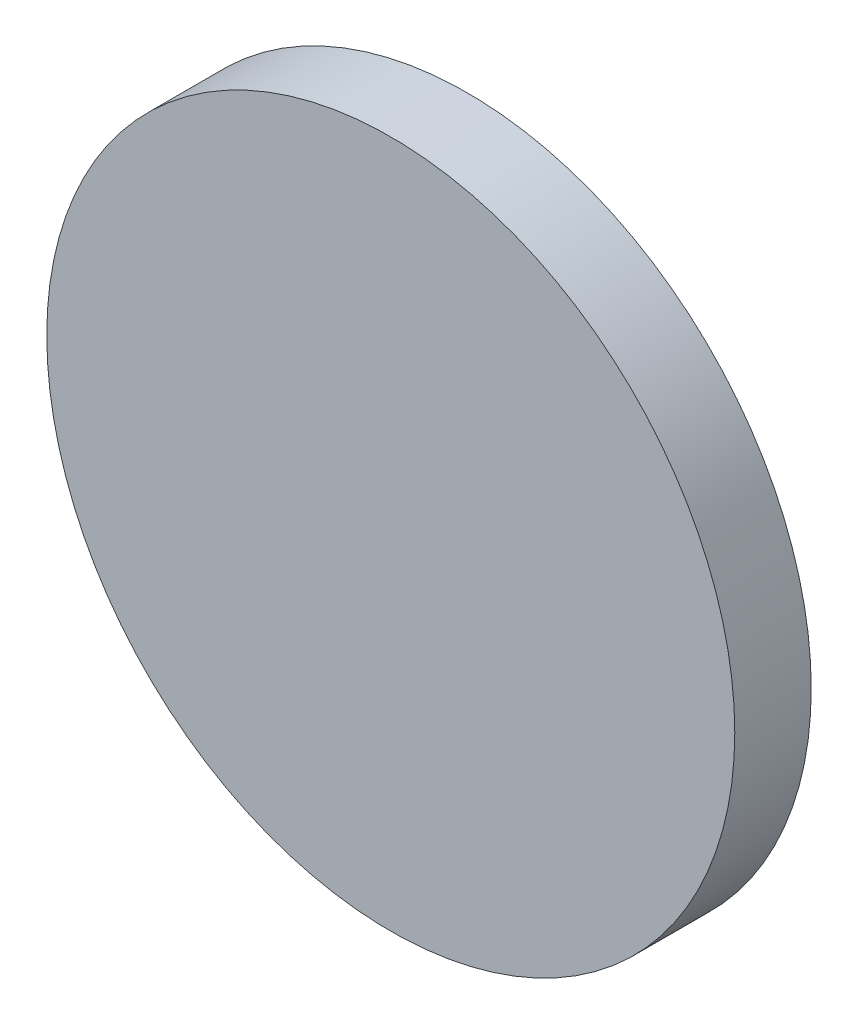
ISO-10303-21;
HEADER;
FILE_DESCRIPTION(('STEP AP214'),'2;1');
FILE_NAME('part.step','',(''),(''),'','','');
FILE_SCHEMA(('AUTOMOTIVE_DESIGN { 1 0 10303 214 1 1 1 1 }'));
ENDSEC;
DATA;
#1=APPLICATION_CONTEXT('core data for automotive mechanical design processes');
#2=APPLICATION_PROTOCOL_DEFINITION('international standard','automotive_design',2000,#1);
#3=PRODUCT_CONTEXT('',#1,'mechanical');
#4=PRODUCT('Part','Part','',(#3));
#5=PRODUCT_RELATED_PRODUCT_CATEGORY('part','',(#4));
#6=PRODUCT_DEFINITION_FORMATION('','',#4);
#7=PRODUCT_DEFINITION_CONTEXT('part definition',#1,'design');
#8=PRODUCT_DEFINITION('design','',#6,#7);
#9=PRODUCT_DEFINITION_SHAPE('','',#8);
#10=(LENGTH_UNIT() NAMED_UNIT(*) SI_UNIT(.MILLI.,.METRE.));
#11=(NAMED_UNIT(*) PLANE_ANGLE_UNIT() SI_UNIT($,.RADIAN.));
#12=(NAMED_UNIT(*) SI_UNIT($,.STERADIAN.) SOLID_ANGLE_UNIT());
#13=UNCERTAINTY_MEASURE_WITH_UNIT(LENGTH_MEASURE(1.E-05),#10,'distance_accuracy_value','');
#14=(GEOMETRIC_REPRESENTATION_CONTEXT(3) GLOBAL_UNCERTAINTY_ASSIGNED_CONTEXT((#13)) GLOBAL_UNIT_ASSIGNED_CONTEXT((#10,
#11,#12)) REPRESENTATION_CONTEXT('',''));
#15=CARTESIAN_POINT('',(0.,0.,0.));
#16=DIRECTION('',(0.,0.,1.));
#17=DIRECTION('',(1.,0.,0.));
#18=AXIS2_PLACEMENT_3D('',#15,#16,#17);
#19=CARTESIAN_POINT('',(0.,0.,10.));
#20=DIRECTION('',(0.,0.,-1.));
#21=DIRECTION('',(-1.,0.,0.));
#22=AXIS2_PLACEMENT_3D('',#19,#20,#21);
#23=CYLINDRICAL_SURFACE('',#22,45.);
#24=CARTESIAN_POINT('',(0.,0.,10.));
#25=DIRECTION('',(0.,0.,1.));
#26=DIRECTION('',(1.,0.,0.));
#27=AXIS2_PLACEMENT_3D('',#24,#25,#26);
#28=CIRCLE('',#27,45.);
#29=CARTESIAN_POINT('',(45.,0.,10.));
#30=VERTEX_POINT('',#29);
#31=EDGE_CURVE('E10',#30,#30,#28,.T.);
#32=ORIENTED_EDGE('',*,*,#31,.F.);
#33=EDGE_LOOP('',(#32));
#34=FACE_BOUND('',#33,.T.);
#35=CARTESIAN_POINT('',(0.,0.,0.));
#36=DIRECTION('',(0.,0.,1.));
#37=DIRECTION('',(1.,0.,0.));
#38=AXIS2_PLACEMENT_3D('',#35,#36,#37);
#39=CIRCLE('',#38,45.);
#40=CARTESIAN_POINT('',(45.,0.,0.));
#41=VERTEX_POINT('',#40);
#42=EDGE_CURVE('E37',#41,#41,#39,.T.);
#43=ORIENTED_EDGE('',*,*,#42,.T.);
#44=EDGE_LOOP('',(#43));
#45=FACE_BOUND('',#44,.T.);
#46=ADVANCED_FACE('F34',(#34,#45),#23,.T.);
#47=CARTESIAN_POINT('',(0.,0.,10.));
#48=DIRECTION('',(0.,0.,1.));
#49=DIRECTION('',(1.,0.,0.));
#50=AXIS2_PLACEMENT_3D('',#47,#48,#49);
#51=PLANE('',#50);
#52=ORIENTED_EDGE('',*,*,#31,.T.);
#53=EDGE_LOOP('',(#52));
#54=FACE_BOUND('',#53,.T.);
#55=ADVANCED_FACE('F49',(#54),#51,.T.);
#56=CARTESIAN_POINT('',(0.,0.,0.));
#57=DIRECTION('',(0.,0.,1.));
#58=DIRECTION('',(1.,0.,0.));
#59=AXIS2_PLACEMENT_3D('',#56,#57,#58);
#60=PLANE('',#59);
#61=ORIENTED_EDGE('',*,*,#42,.F.);
#62=EDGE_LOOP('',(#61));
#63=FACE_BOUND('',#62,.T.);
#64=ADVANCED_FACE('F47',(#63),#60,.F.);
#65=CLOSED_SHELL('',(#46,#55,#64));
#66=MANIFOLD_SOLID_BREP('B2',#65);
#67=ADVANCED_BREP_SHAPE_REPRESENTATION('',(#18,#66),#14);
#68=SHAPE_DEFINITION_REPRESENTATION(#9,#67);
ENDSEC;
END-ISO-10303-21;
